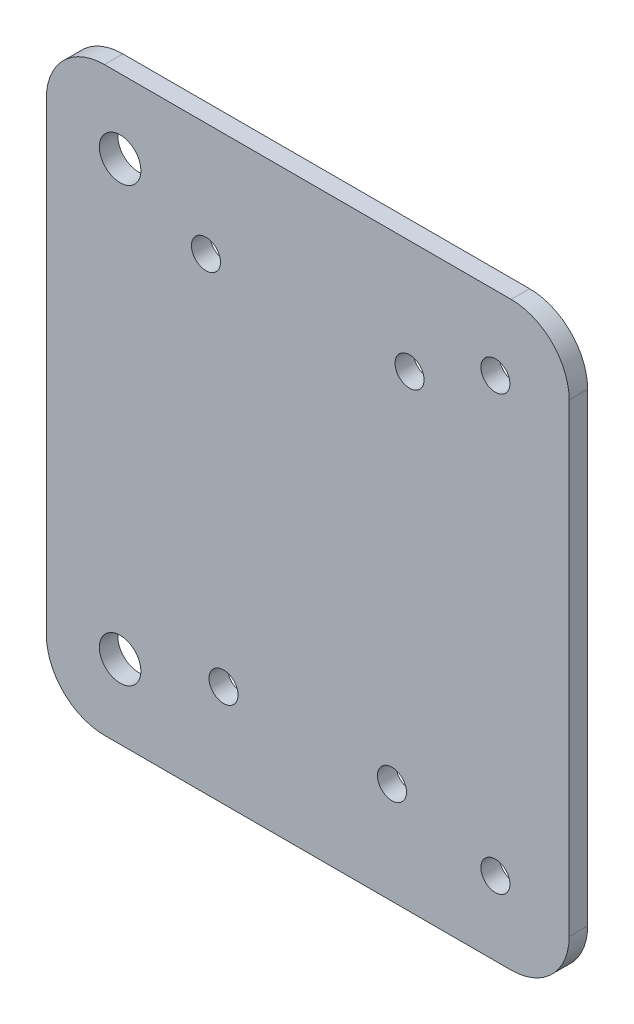
ISO-10303-21;
HEADER;
FILE_DESCRIPTION(('STEP AP214'),'2;1');
FILE_NAME('part.step','',(''),(''),'','','');
FILE_SCHEMA(('AUTOMOTIVE_DESIGN { 1 0 10303 214 1 1 1 1 }'));
ENDSEC;
DATA;
#1=APPLICATION_CONTEXT('core data for automotive mechanical design processes');
#2=APPLICATION_PROTOCOL_DEFINITION('international standard','automotive_design',2000,#1);
#3=PRODUCT_CONTEXT('',#1,'mechanical');
#4=PRODUCT('Part','Part','',(#3));
#5=PRODUCT_RELATED_PRODUCT_CATEGORY('part','',(#4));
#6=PRODUCT_DEFINITION_FORMATION('','',#4);
#7=PRODUCT_DEFINITION_CONTEXT('part definition',#1,'design');
#8=PRODUCT_DEFINITION('design','',#6,#7);
#9=PRODUCT_DEFINITION_SHAPE('','',#8);
#10=(LENGTH_UNIT() NAMED_UNIT(*) SI_UNIT(.MILLI.,.METRE.));
#11=(NAMED_UNIT(*) PLANE_ANGLE_UNIT() SI_UNIT($,.RADIAN.));
#12=(NAMED_UNIT(*) SI_UNIT($,.STERADIAN.) SOLID_ANGLE_UNIT());
#13=UNCERTAINTY_MEASURE_WITH_UNIT(LENGTH_MEASURE(1.E-05),#10,'distance_accuracy_value','');
#14=(GEOMETRIC_REPRESENTATION_CONTEXT(3) GLOBAL_UNCERTAINTY_ASSIGNED_CONTEXT((#13)) GLOBAL_UNIT_ASSIGNED_CONTEXT((#10,
#11,#12)) REPRESENTATION_CONTEXT('',''));
#15=CARTESIAN_POINT('',(0.,0.,0.));
#16=DIRECTION('',(0.,0.,1.));
#17=DIRECTION('',(1.,0.,0.));
#18=AXIS2_PLACEMENT_3D('',#15,#16,#17);
#19=CARTESIAN_POINT('',(-45.,-55.,-3.18));
#20=DIRECTION('',(-1.,0.,0.));
#21=DIRECTION('',(0.,0.,1.));
#22=AXIS2_PLACEMENT_3D('',#19,#20,#21);
#23=PLANE('',#22);
#24=DIRECTION('',(0.,-1.,0.));
#25=VECTOR('',#24,1.);
#26=CARTESIAN_POINT('',(-45.,-55.,-3.18));
#27=LINE('',#26,#25);
#28=CARTESIAN_POINT('',(-45.,35.,-3.18));
#29=VERTEX_POINT('',#28);
#30=CARTESIAN_POINT('',(-45.,-45.,-3.18));
#31=VERTEX_POINT('',#30);
#32=EDGE_CURVE('E155',#29,#31,#27,.T.);
#33=ORIENTED_EDGE('',*,*,#32,.T.);
#34=DIRECTION('',(0.,0.,1.));
#35=VECTOR('',#34,1.);
#36=CARTESIAN_POINT('',(-45.,-45.,-3.18));
#37=LINE('',#36,#35);
#38=CARTESIAN_POINT('',(-45.,-45.,0.));
#39=VERTEX_POINT('',#38);
#40=EDGE_CURVE('E11',#31,#39,#37,.T.);
#41=ORIENTED_EDGE('',*,*,#40,.T.);
#42=DIRECTION('',(0.,-1.,0.));
#43=VECTOR('',#42,1.);
#44=CARTESIAN_POINT('',(-45.,-55.,0.));
#45=LINE('',#44,#43);
#46=CARTESIAN_POINT('',(-45.,35.,0.));
#47=VERTEX_POINT('',#46);
#48=EDGE_CURVE('E105',#47,#39,#45,.T.);
#49=ORIENTED_EDGE('',*,*,#48,.F.);
#50=DIRECTION('',(0.,0.,1.));
#51=VECTOR('',#50,1.);
#52=CARTESIAN_POINT('',(-45.,35.,-3.18));
#53=LINE('',#52,#51);
#54=EDGE_CURVE('E41',#47,#29,#53,.F.);
#55=ORIENTED_EDGE('',*,*,#54,.T.);
#56=EDGE_LOOP('',(#33,#41,#49,#55));
#57=FACE_BOUND('',#56,.T.);
#58=ADVANCED_FACE('F33',(#57),#23,.T.);
#59=CARTESIAN_POINT('',(-45.,45.,-3.18));
#60=DIRECTION('',(0.,1.,0.));
#61=DIRECTION('',(0.,0.,1.));
#62=AXIS2_PLACEMENT_3D('',#59,#60,#61);
#63=PLANE('',#62);
#64=DIRECTION('',(-1.,0.,0.));
#65=VECTOR('',#64,1.);
#66=CARTESIAN_POINT('',(-45.,45.,0.));
#67=LINE('',#66,#65);
#68=CARTESIAN_POINT('',(35.,45.,0.));
#69=VERTEX_POINT('',#68);
#70=CARTESIAN_POINT('',(-35.,45.,0.));
#71=VERTEX_POINT('',#70);
#72=EDGE_CURVE('E131',#69,#71,#67,.T.);
#73=ORIENTED_EDGE('',*,*,#72,.F.);
#74=DIRECTION('',(0.,0.,1.));
#75=VECTOR('',#74,1.);
#76=CARTESIAN_POINT('',(35.,45.,-3.18));
#77=LINE('',#76,#75);
#78=CARTESIAN_POINT('',(35.,45.,-3.18));
#79=VERTEX_POINT('',#78);
#80=EDGE_CURVE('E55',#69,#79,#77,.F.);
#81=ORIENTED_EDGE('',*,*,#80,.T.);
#82=DIRECTION('',(-1.,0.,0.));
#83=VECTOR('',#82,1.);
#84=CARTESIAN_POINT('',(-45.,45.,-3.18));
#85=LINE('',#84,#83);
#86=CARTESIAN_POINT('',(-35.,45.,-3.18));
#87=VERTEX_POINT('',#86);
#88=EDGE_CURVE('E125',#79,#87,#85,.T.);
#89=ORIENTED_EDGE('',*,*,#88,.T.);
#90=DIRECTION('',(0.,0.,1.));
#91=VECTOR('',#90,1.);
#92=CARTESIAN_POINT('',(-35.,45.,-3.18));
#93=LINE('',#92,#91);
#94=EDGE_CURVE('E149',#87,#71,#93,.T.);
#95=ORIENTED_EDGE('',*,*,#94,.T.);
#96=EDGE_LOOP('',(#73,#81,#89,#95));
#97=FACE_BOUND('',#96,.T.);
#98=ADVANCED_FACE('F163',(#97),#63,.T.);
#99=CARTESIAN_POINT('',(45.,-55.,-3.18));
#100=DIRECTION('',(1.,0.,0.));
#101=DIRECTION('',(0.,0.,-1.));
#102=AXIS2_PLACEMENT_3D('',#99,#100,#101);
#103=PLANE('',#102);
#104=DIRECTION('',(0.,1.,0.));
#105=VECTOR('',#104,1.);
#106=CARTESIAN_POINT('',(45.,-55.,0.));
#107=LINE('',#106,#105);
#108=CARTESIAN_POINT('',(45.,-45.,0.));
#109=VERTEX_POINT('',#108);
#110=CARTESIAN_POINT('',(45.,35.,0.));
#111=VERTEX_POINT('',#110);
#112=EDGE_CURVE('E120',#109,#111,#107,.T.);
#113=ORIENTED_EDGE('',*,*,#112,.F.);
#114=DIRECTION('',(0.,0.,1.));
#115=VECTOR('',#114,1.);
#116=CARTESIAN_POINT('',(45.,-45.,-3.18));
#117=LINE('',#116,#115);
#118=CARTESIAN_POINT('',(45.,-45.,-3.18));
#119=VERTEX_POINT('',#118);
#120=EDGE_CURVE('E141',#109,#119,#117,.F.);
#121=ORIENTED_EDGE('',*,*,#120,.T.);
#122=DIRECTION('',(0.,1.,0.));
#123=VECTOR('',#122,1.);
#124=CARTESIAN_POINT('',(45.,-55.,-3.18));
#125=LINE('',#124,#123);
#126=CARTESIAN_POINT('',(45.,35.,-3.18));
#127=VERTEX_POINT('',#126);
#128=EDGE_CURVE('E128',#119,#127,#125,.T.);
#129=ORIENTED_EDGE('',*,*,#128,.T.);
#130=DIRECTION('',(0.,0.,1.));
#131=VECTOR('',#130,1.);
#132=CARTESIAN_POINT('',(45.,35.,-3.18));
#133=LINE('',#132,#131);
#134=EDGE_CURVE('E138',#127,#111,#133,.T.);
#135=ORIENTED_EDGE('',*,*,#134,.T.);
#136=EDGE_LOOP('',(#113,#121,#129,#135));
#137=FACE_BOUND('',#136,.T.);
#138=ADVANCED_FACE('F258',(#137),#103,.T.);
#139=CARTESIAN_POINT('',(-45.,-55.,-3.18));
#140=DIRECTION('',(0.,-1.,0.));
#141=DIRECTION('',(0.,0.,-1.));
#142=AXIS2_PLACEMENT_3D('',#139,#140,#141);
#143=PLANE('',#142);
#144=DIRECTION('',(1.,0.,0.));
#145=VECTOR('',#144,1.);
#146=CARTESIAN_POINT('',(-45.,-55.,-3.18));
#147=LINE('',#146,#145);
#148=CARTESIAN_POINT('',(-35.,-55.,-3.18));
#149=VERTEX_POINT('',#148);
#150=CARTESIAN_POINT('',(35.,-55.,-3.18));
#151=VERTEX_POINT('',#150);
#152=EDGE_CURVE('E159',#149,#151,#147,.T.);
#153=ORIENTED_EDGE('',*,*,#152,.T.);
#154=DIRECTION('',(0.,0.,1.));
#155=VECTOR('',#154,1.);
#156=CARTESIAN_POINT('',(35.,-55.,-3.18));
#157=LINE('',#156,#155);
#158=CARTESIAN_POINT('',(35.,-55.,0.));
#159=VERTEX_POINT('',#158);
#160=EDGE_CURVE('E119',#151,#159,#157,.T.);
#161=ORIENTED_EDGE('',*,*,#160,.T.);
#162=DIRECTION('',(1.,0.,0.));
#163=VECTOR('',#162,1.);
#164=CARTESIAN_POINT('',(-45.,-55.,0.));
#165=LINE('',#164,#163);
#166=CARTESIAN_POINT('',(-35.,-55.,0.));
#167=VERTEX_POINT('',#166);
#168=EDGE_CURVE('E103',#167,#159,#165,.T.);
#169=ORIENTED_EDGE('',*,*,#168,.F.);
#170=DIRECTION('',(0.,0.,1.));
#171=VECTOR('',#170,1.);
#172=CARTESIAN_POINT('',(-35.,-55.,-3.18));
#173=LINE('',#172,#171);
#174=EDGE_CURVE('E116',#167,#149,#173,.F.);
#175=ORIENTED_EDGE('',*,*,#174,.T.);
#176=EDGE_LOOP('',(#153,#161,#169,#175));
#177=FACE_BOUND('',#176,.T.);
#178=ADVANCED_FACE('F115',(#177),#143,.T.);
#179=CARTESIAN_POINT('',(0.,0.,-3.18));
#180=DIRECTION('',(0.,0.,-1.));
#181=DIRECTION('',(-1.,0.,0.));
#182=AXIS2_PLACEMENT_3D('',#179,#180,#181);
#183=PLANE('',#182);
#184=CARTESIAN_POINT('',(17.5231464345678,25.5077588546236,-3.18));
#185=DIRECTION('',(0.,0.,-1.));
#186=DIRECTION('',(-1.,0.,0.));
#187=AXIS2_PLACEMENT_3D('',#184,#185,#186);
#188=CIRCLE('',#187,2.5);
#189=CARTESIAN_POINT('',(15.0231464345678,25.5077588546236,-3.18));
#190=VERTEX_POINT('',#189);
#191=EDGE_CURVE('E213',#190,#190,#188,.T.);
#192=ORIENTED_EDGE('',*,*,#191,.F.);
#193=EDGE_LOOP('',(#192));
#194=FACE_BOUND('',#193,.T.);
#195=CARTESIAN_POINT('',(-17.5231464345675,25.5077588546236,-3.18));
#196=DIRECTION('',(0.,0.,-1.));
#197=DIRECTION('',(-1.,0.,0.));
#198=AXIS2_PLACEMENT_3D('',#195,#196,#197);
#199=CIRCLE('',#198,2.5);
#200=CARTESIAN_POINT('',(-20.0231464345675,25.5077588546236,-3.18));
#201=VERTEX_POINT('',#200);
#202=EDGE_CURVE('E207',#201,#201,#199,.T.);
#203=ORIENTED_EDGE('',*,*,#202,.F.);
#204=EDGE_LOOP('',(#203));
#205=FACE_BOUND('',#204,.T.);
#206=CARTESIAN_POINT('',(14.5000000000002,-37.5,-3.18));
#207=DIRECTION('',(0.,0.,-1.));
#208=DIRECTION('',(-1.,0.,0.));
#209=AXIS2_PLACEMENT_3D('',#206,#207,#208);
#210=CIRCLE('',#209,2.5);
#211=CARTESIAN_POINT('',(12.0000000000002,-37.5,-3.18));
#212=VERTEX_POINT('',#211);
#213=EDGE_CURVE('E201',#212,#212,#210,.T.);
#214=ORIENTED_EDGE('',*,*,#213,.F.);
#215=EDGE_LOOP('',(#214));
#216=FACE_BOUND('',#215,.T.);
#217=CARTESIAN_POINT('',(-14.4999999999998,-37.5,-3.18));
#218=DIRECTION('',(0.,0.,-1.));
#219=DIRECTION('',(-1.,0.,0.));
#220=AXIS2_PLACEMENT_3D('',#217,#218,#219);
#221=CIRCLE('',#220,2.5);
#222=CARTESIAN_POINT('',(-16.9999999999998,-37.5,-3.18));
#223=VERTEX_POINT('',#222);
#224=EDGE_CURVE('E193',#223,#223,#221,.T.);
#225=ORIENTED_EDGE('',*,*,#224,.F.);
#226=EDGE_LOOP('',(#225));
#227=FACE_BOUND('',#226,.T.);
#228=CARTESIAN_POINT('',(32.3,32.3000000000001,-3.18));
#229=DIRECTION('',(0.,0.,1.));
#230=DIRECTION('',(1.,0.,0.));
#231=AXIS2_PLACEMENT_3D('',#228,#229,#230);
#232=CIRCLE('',#231,2.5);
#233=CARTESIAN_POINT('',(34.8,32.3000000000001,-3.18));
#234=VERTEX_POINT('',#233);
#235=EDGE_CURVE('E187',#234,#234,#232,.T.);
#236=ORIENTED_EDGE('',*,*,#235,.T.);
#237=EDGE_LOOP('',(#236));
#238=FACE_BOUND('',#237,.T.);
#239=CARTESIAN_POINT('',(-32.3,32.3,-3.18));
#240=DIRECTION('',(0.,0.,1.));
#241=DIRECTION('',(1.,0.,0.));
#242=AXIS2_PLACEMENT_3D('',#239,#240,#241);
#243=CIRCLE('',#242,3.57);
#244=CARTESIAN_POINT('',(-28.73,32.3,-3.18));
#245=VERTEX_POINT('',#244);
#246=EDGE_CURVE('E181',#245,#245,#243,.T.);
#247=ORIENTED_EDGE('',*,*,#246,.T.);
#248=EDGE_LOOP('',(#247));
#249=FACE_BOUND('',#248,.T.);
#250=CARTESIAN_POINT('',(-32.3,-42.3,-3.18));
#251=DIRECTION('',(0.,0.,1.));
#252=DIRECTION('',(1.,0.,0.));
#253=AXIS2_PLACEMENT_3D('',#250,#251,#252);
#254=CIRCLE('',#253,3.57);
#255=CARTESIAN_POINT('',(-28.73,-42.3,-3.18));
#256=VERTEX_POINT('',#255);
#257=EDGE_CURVE('E175',#256,#256,#254,.T.);
#258=ORIENTED_EDGE('',*,*,#257,.T.);
#259=EDGE_LOOP('',(#258));
#260=FACE_BOUND('',#259,.T.);
#261=CARTESIAN_POINT('',(32.3,-42.3,-3.18));
#262=DIRECTION('',(0.,0.,1.));
#263=DIRECTION('',(1.,0.,0.));
#264=AXIS2_PLACEMENT_3D('',#261,#262,#263);
#265=CIRCLE('',#264,2.5);
#266=CARTESIAN_POINT('',(34.8,-42.3,-3.18));
#267=VERTEX_POINT('',#266);
#268=EDGE_CURVE('E167',#267,#267,#265,.T.);
#269=ORIENTED_EDGE('',*,*,#268,.T.);
#270=EDGE_LOOP('',(#269));
#271=FACE_BOUND('',#270,.T.);
#272=ORIENTED_EDGE('',*,*,#128,.F.);
#273=CARTESIAN_POINT('',(35.,-45.,-3.18));
#274=DIRECTION('',(0.,0.,-1.));
#275=DIRECTION('',(-1.,0.,0.));
#276=AXIS2_PLACEMENT_3D('',#273,#274,#275);
#277=CIRCLE('',#276,10.);
#278=EDGE_CURVE('E147',#119,#151,#277,.T.);
#279=ORIENTED_EDGE('',*,*,#278,.T.);
#280=ORIENTED_EDGE('',*,*,#152,.F.);
#281=CARTESIAN_POINT('',(-35.,-45.,-3.18));
#282=DIRECTION('',(0.,0.,-1.));
#283=DIRECTION('',(-1.,0.,0.));
#284=AXIS2_PLACEMENT_3D('',#281,#282,#283);
#285=CIRCLE('',#284,10.);
#286=EDGE_CURVE('E124',#149,#31,#285,.T.);
#287=ORIENTED_EDGE('',*,*,#286,.T.);
#288=ORIENTED_EDGE('',*,*,#32,.F.);
#289=CARTESIAN_POINT('',(-35.,35.,-3.18));
#290=DIRECTION('',(0.,0.,-1.));
#291=DIRECTION('',(-1.,0.,0.));
#292=AXIS2_PLACEMENT_3D('',#289,#290,#291);
#293=CIRCLE('',#292,10.);
#294=EDGE_CURVE('E48',#29,#87,#293,.T.);
#295=ORIENTED_EDGE('',*,*,#294,.T.);
#296=ORIENTED_EDGE('',*,*,#88,.F.);
#297=CARTESIAN_POINT('',(35.,35.,-3.18));
#298=DIRECTION('',(0.,0.,-1.));
#299=DIRECTION('',(-1.,0.,0.));
#300=AXIS2_PLACEMENT_3D('',#297,#298,#299);
#301=CIRCLE('',#300,10.);
#302=EDGE_CURVE('E145',#79,#127,#301,.T.);
#303=ORIENTED_EDGE('',*,*,#302,.T.);
#304=EDGE_LOOP('',(#272,#279,#280,#287,#288,#295,#296,#303));
#305=FACE_BOUND('',#304,.T.);
#306=ADVANCED_FACE('F158',(#194,#205,#216,#227,#238,#249,#260,#271,#305),#183,.T.);
#307=CARTESIAN_POINT('',(0.,0.,0.));
#308=DIRECTION('',(0.,0.,-1.));
#309=DIRECTION('',(-1.,0.,0.));
#310=AXIS2_PLACEMENT_3D('',#307,#308,#309);
#311=PLANE('',#310);
#312=CARTESIAN_POINT('',(17.5231464345678,25.5077588546236,0.));
#313=DIRECTION('',(0.,0.,1.));
#314=DIRECTION('',(1.,0.,0.));
#315=AXIS2_PLACEMENT_3D('',#312,#313,#314);
#316=CIRCLE('',#315,2.5);
#317=CARTESIAN_POINT('',(20.0231464345678,25.5077588546236,0.));
#318=VERTEX_POINT('',#317);
#319=EDGE_CURVE('E216',#318,#318,#316,.T.);
#320=ORIENTED_EDGE('',*,*,#319,.F.);
#321=EDGE_LOOP('',(#320));
#322=FACE_BOUND('',#321,.T.);
#323=CARTESIAN_POINT('',(-17.5231464345675,25.5077588546236,0.));
#324=DIRECTION('',(0.,0.,1.));
#325=DIRECTION('',(1.,0.,0.));
#326=AXIS2_PLACEMENT_3D('',#323,#324,#325);
#327=CIRCLE('',#326,2.5);
#328=CARTESIAN_POINT('',(-15.0231464345675,25.5077588546236,0.));
#329=VERTEX_POINT('',#328);
#330=EDGE_CURVE('E210',#329,#329,#327,.T.);
#331=ORIENTED_EDGE('',*,*,#330,.F.);
#332=EDGE_LOOP('',(#331));
#333=FACE_BOUND('',#332,.T.);
#334=CARTESIAN_POINT('',(14.5000000000002,-37.5,0.));
#335=DIRECTION('',(0.,0.,1.));
#336=DIRECTION('',(1.,0.,0.));
#337=AXIS2_PLACEMENT_3D('',#334,#335,#336);
#338=CIRCLE('',#337,2.5);
#339=CARTESIAN_POINT('',(17.0000000000002,-37.5,0.));
#340=VERTEX_POINT('',#339);
#341=EDGE_CURVE('E204',#340,#340,#338,.T.);
#342=ORIENTED_EDGE('',*,*,#341,.F.);
#343=EDGE_LOOP('',(#342));
#344=FACE_BOUND('',#343,.T.);
#345=CARTESIAN_POINT('',(-14.4999999999998,-37.5,0.));
#346=DIRECTION('',(0.,0.,1.));
#347=DIRECTION('',(1.,0.,0.));
#348=AXIS2_PLACEMENT_3D('',#345,#346,#347);
#349=CIRCLE('',#348,2.5);
#350=CARTESIAN_POINT('',(-11.9999999999998,-37.5,0.));
#351=VERTEX_POINT('',#350);
#352=EDGE_CURVE('E198',#351,#351,#349,.T.);
#353=ORIENTED_EDGE('',*,*,#352,.F.);
#354=EDGE_LOOP('',(#353));
#355=FACE_BOUND('',#354,.T.);
#356=CARTESIAN_POINT('',(32.3,32.3000000000001,0.));
#357=DIRECTION('',(0.,0.,1.));
#358=DIRECTION('',(1.,0.,0.));
#359=AXIS2_PLACEMENT_3D('',#356,#357,#358);
#360=CIRCLE('',#359,2.5);
#361=CARTESIAN_POINT('',(34.8,32.3000000000001,0.));
#362=VERTEX_POINT('',#361);
#363=EDGE_CURVE('E190',#362,#362,#360,.T.);
#364=ORIENTED_EDGE('',*,*,#363,.F.);
#365=EDGE_LOOP('',(#364));
#366=FACE_BOUND('',#365,.T.);
#367=CARTESIAN_POINT('',(-32.3,32.3,0.));
#368=DIRECTION('',(0.,0.,1.));
#369=DIRECTION('',(1.,0.,0.));
#370=AXIS2_PLACEMENT_3D('',#367,#368,#369);
#371=CIRCLE('',#370,3.57);
#372=CARTESIAN_POINT('',(-28.73,32.3,0.));
#373=VERTEX_POINT('',#372);
#374=EDGE_CURVE('E184',#373,#373,#371,.T.);
#375=ORIENTED_EDGE('',*,*,#374,.F.);
#376=EDGE_LOOP('',(#375));
#377=FACE_BOUND('',#376,.T.);
#378=CARTESIAN_POINT('',(-32.3,-42.3,0.));
#379=DIRECTION('',(0.,0.,1.));
#380=DIRECTION('',(1.,0.,0.));
#381=AXIS2_PLACEMENT_3D('',#378,#379,#380);
#382=CIRCLE('',#381,3.57);
#383=CARTESIAN_POINT('',(-28.73,-42.3,0.));
#384=VERTEX_POINT('',#383);
#385=EDGE_CURVE('E178',#384,#384,#382,.T.);
#386=ORIENTED_EDGE('',*,*,#385,.F.);
#387=EDGE_LOOP('',(#386));
#388=FACE_BOUND('',#387,.T.);
#389=CARTESIAN_POINT('',(32.3,-42.3,0.));
#390=DIRECTION('',(0.,0.,1.));
#391=DIRECTION('',(1.,0.,0.));
#392=AXIS2_PLACEMENT_3D('',#389,#390,#391);
#393=CIRCLE('',#392,2.5);
#394=CARTESIAN_POINT('',(34.8,-42.3,0.));
#395=VERTEX_POINT('',#394);
#396=EDGE_CURVE('E172',#395,#395,#393,.T.);
#397=ORIENTED_EDGE('',*,*,#396,.F.);
#398=EDGE_LOOP('',(#397));
#399=FACE_BOUND('',#398,.T.);
#400=ORIENTED_EDGE('',*,*,#168,.T.);
#401=CARTESIAN_POINT('',(35.,-45.,0.));
#402=DIRECTION('',(0.,0.,-1.));
#403=DIRECTION('',(-1.,0.,0.));
#404=AXIS2_PLACEMENT_3D('',#401,#402,#403);
#405=CIRCLE('',#404,10.);
#406=EDGE_CURVE('E136',#159,#109,#405,.F.);
#407=ORIENTED_EDGE('',*,*,#406,.T.);
#408=ORIENTED_EDGE('',*,*,#112,.T.);
#409=CARTESIAN_POINT('',(35.,35.,0.));
#410=DIRECTION('',(0.,0.,-1.));
#411=DIRECTION('',(-1.,0.,0.));
#412=AXIS2_PLACEMENT_3D('',#409,#410,#411);
#413=CIRCLE('',#412,10.);
#414=EDGE_CURVE('E109',#111,#69,#413,.F.);
#415=ORIENTED_EDGE('',*,*,#414,.T.);
#416=ORIENTED_EDGE('',*,*,#72,.T.);
#417=CARTESIAN_POINT('',(-35.,35.,0.));
#418=DIRECTION('',(0.,0.,-1.));
#419=DIRECTION('',(-1.,0.,0.));
#420=AXIS2_PLACEMENT_3D('',#417,#418,#419);
#421=CIRCLE('',#420,10.);
#422=EDGE_CURVE('E110',#71,#47,#421,.F.);
#423=ORIENTED_EDGE('',*,*,#422,.T.);
#424=ORIENTED_EDGE('',*,*,#48,.T.);
#425=CARTESIAN_POINT('',(-35.,-45.,0.));
#426=DIRECTION('',(0.,0.,-1.));
#427=DIRECTION('',(-1.,0.,0.));
#428=AXIS2_PLACEMENT_3D('',#425,#426,#427);
#429=CIRCLE('',#428,10.);
#430=EDGE_CURVE('E100',#39,#167,#429,.F.);
#431=ORIENTED_EDGE('',*,*,#430,.T.);
#432=EDGE_LOOP('',(#400,#407,#408,#415,#416,#423,#424,#431));
#433=FACE_BOUND('',#432,.T.);
#434=ADVANCED_FACE('F102',(#322,#333,#344,#355,#366,#377,#388,#399,#433),#311,.F.);
#435=CARTESIAN_POINT('',(32.3,-42.3,-3.18));
#436=DIRECTION('',(0.,0.,1.));
#437=DIRECTION('',(1.,0.,0.));
#438=AXIS2_PLACEMENT_3D('',#435,#436,#437);
#439=CYLINDRICAL_SURFACE('',#438,2.5);
#440=CARTESIAN_POINT('',(34.8,-42.3,-3.18));
#441=CARTESIAN_POINT('',(34.8,-42.3,-3.146875));
#442=CARTESIAN_POINT('',(34.8,-42.3,-3.11375));
#443=CARTESIAN_POINT('',(34.8,-42.3,-3.0475));
#444=CARTESIAN_POINT('',(34.8,-42.3,-3.014375));
#445=CARTESIAN_POINT('',(34.8,-42.3,-2.948125));
#446=CARTESIAN_POINT('',(34.8,-42.3,-2.915));
#447=CARTESIAN_POINT('',(34.8,-42.3,-2.84875));
#448=CARTESIAN_POINT('',(34.8,-42.3,-2.815625));
#449=CARTESIAN_POINT('',(34.8,-42.3,-2.749375));
#450=CARTESIAN_POINT('',(34.8,-42.3,-2.71625));
#451=CARTESIAN_POINT('',(34.8,-42.3,-2.65));
#452=CARTESIAN_POINT('',(34.8,-42.3,-2.616875));
#453=CARTESIAN_POINT('',(34.8,-42.3,-2.550625));
#454=CARTESIAN_POINT('',(34.8,-42.3,-2.5175));
#455=CARTESIAN_POINT('',(34.8,-42.3,-2.45125));
#456=CARTESIAN_POINT('',(34.8,-42.3,-2.418125));
#457=CARTESIAN_POINT('',(34.8,-42.3,-2.351875));
#458=CARTESIAN_POINT('',(34.8,-42.3,-2.31875));
#459=CARTESIAN_POINT('',(34.8,-42.3,-2.2525));
#460=CARTESIAN_POINT('',(34.8,-42.3,-2.219375));
#461=CARTESIAN_POINT('',(34.8,-42.3,-2.153125));
#462=CARTESIAN_POINT('',(34.8,-42.3,-2.12));
#463=CARTESIAN_POINT('',(34.8,-42.3,-2.05375));
#464=CARTESIAN_POINT('',(34.8,-42.3,-2.020625));
#465=CARTESIAN_POINT('',(34.8,-42.3,-1.954375));
#466=CARTESIAN_POINT('',(34.8,-42.3,-1.92125));
#467=CARTESIAN_POINT('',(34.8,-42.3,-1.855));
#468=CARTESIAN_POINT('',(34.8,-42.3,-1.821875));
#469=CARTESIAN_POINT('',(34.8,-42.3,-1.755625));
#470=CARTESIAN_POINT('',(34.8,-42.3,-1.7225));
#471=CARTESIAN_POINT('',(34.8,-42.3,-1.65625));
#472=CARTESIAN_POINT('',(34.8,-42.3,-1.623125));
#473=CARTESIAN_POINT('',(34.8,-42.3,-1.556875));
#474=CARTESIAN_POINT('',(34.8,-42.3,-1.52375));
#475=CARTESIAN_POINT('',(34.8,-42.3,-1.4575));
#476=CARTESIAN_POINT('',(34.8,-42.3,-1.424375));
#477=CARTESIAN_POINT('',(34.8,-42.3,-1.358125));
#478=CARTESIAN_POINT('',(34.8,-42.3,-1.325));
#479=CARTESIAN_POINT('',(34.8,-42.3,-1.25875));
#480=CARTESIAN_POINT('',(34.8,-42.3,-1.225625));
#481=CARTESIAN_POINT('',(34.8,-42.3,-1.159375));
#482=CARTESIAN_POINT('',(34.8,-42.3,-1.12625));
#483=CARTESIAN_POINT('',(34.8,-42.3,-1.06));
#484=CARTESIAN_POINT('',(34.8,-42.3,-1.026875));
#485=CARTESIAN_POINT('',(34.8,-42.3,-0.960625));
#486=CARTESIAN_POINT('',(34.8,-42.3,-0.9275));
#487=CARTESIAN_POINT('',(34.8,-42.3,-0.86125));
#488=CARTESIAN_POINT('',(34.8,-42.3,-0.828125));
#489=CARTESIAN_POINT('',(34.8,-42.3,-0.761875));
#490=CARTESIAN_POINT('',(34.8,-42.3,-0.72875));
#491=CARTESIAN_POINT('',(34.8,-42.3,-0.6625));
#492=CARTESIAN_POINT('',(34.8,-42.3,-0.629375));
#493=CARTESIAN_POINT('',(34.8,-42.3,-0.563125));
#494=CARTESIAN_POINT('',(34.8,-42.3,-0.53));
#495=CARTESIAN_POINT('',(34.8,-42.3,-0.46375));
#496=CARTESIAN_POINT('',(34.8,-42.3,-0.430625));
#497=CARTESIAN_POINT('',(34.8,-42.3,-0.364375));
#498=CARTESIAN_POINT('',(34.8,-42.3,-0.33125));
#499=CARTESIAN_POINT('',(34.8,-42.3,-0.265));
#500=CARTESIAN_POINT('',(34.8,-42.3,-0.231875));
#501=CARTESIAN_POINT('',(34.8,-42.3,-0.165625));
#502=CARTESIAN_POINT('',(34.8,-42.3,-0.1325));
#503=CARTESIAN_POINT('',(34.8,-42.3,-0.06625));
#504=CARTESIAN_POINT('',(34.8,-42.3,-0.033125));
#505=CARTESIAN_POINT('',(34.8,-42.3,0.));
#506=B_SPLINE_CURVE_WITH_KNOTS('',3,(#440,#441,#442,#443,#444,#445,#446,#447,#448,#449,#450,
#451,#452,#453,#454,#455,#456,#457,#458,#459,#460,#461,#462,#463,#464,#465,#466,#467,#468,#469,
#470,#471,#472,#473,#474,#475,#476,#477,#478,#479,#480,#481,#482,#483,#484,#485,#486,#487,#488,
#489,#490,#491,#492,#493,#494,#495,#496,#497,#498,#499,#500,#501,#502,#503,#504,#505),
.UNSPECIFIED.,.F.,.F.,(4,2,2,2,2,2,2,2,2,2,2,2,2,2,2,2,2,2,2,2,2,2,2,2,2,2,2,2,2,2,2,2,4),(0.,
0.0993749999999996,0.19875,0.298125,0.3975,0.496875,0.59625,0.695625,0.795,0.894375,0.99375,
1.093125,1.1925,1.291875,1.39125,1.490625,1.59,1.689375,1.78875,1.888125,1.9875,2.086875,
2.18625,2.285625,2.385,2.484375,2.58375,2.683125,2.7825,2.881875,2.98125,3.080625,3.18),.UNSPECIFIED.);
#507=EDGE_CURVE('BSEAM224',#267,#395,#506,.T.);
#508=ORIENTED_EDGE('',*,*,#268,.F.);
#509=ORIENTED_EDGE('',*,*,#396,.T.);
#510=ORIENTED_EDGE('',*,*,#507,.T.);
#511=ORIENTED_EDGE('',*,*,#507,.F.);
#512=EDGE_LOOP('',(#508,#510,#509,#511));
#513=FACE_BOUND('',#512,.T.);
#514=ADVANCED_FACE('F224',(#513),#439,.F.);
#515=CARTESIAN_POINT('',(-32.3,-42.3,-3.18));
#516=DIRECTION('',(0.,0.,1.));
#517=DIRECTION('',(1.,0.,0.));
#518=AXIS2_PLACEMENT_3D('',#515,#516,#517);
#519=CYLINDRICAL_SURFACE('',#518,3.57);
#520=CARTESIAN_POINT('',(-28.73,-42.3,-3.18));
#521=CARTESIAN_POINT('',(-28.73,-42.3,-3.146875));
#522=CARTESIAN_POINT('',(-28.73,-42.3,-3.11375));
#523=CARTESIAN_POINT('',(-28.73,-42.3,-3.0475));
#524=CARTESIAN_POINT('',(-28.73,-42.3,-3.014375));
#525=CARTESIAN_POINT('',(-28.73,-42.3,-2.948125));
#526=CARTESIAN_POINT('',(-28.73,-42.3,-2.915));
#527=CARTESIAN_POINT('',(-28.73,-42.3,-2.84875));
#528=CARTESIAN_POINT('',(-28.73,-42.3,-2.815625));
#529=CARTESIAN_POINT('',(-28.73,-42.3,-2.749375));
#530=CARTESIAN_POINT('',(-28.73,-42.3,-2.71625));
#531=CARTESIAN_POINT('',(-28.73,-42.3,-2.65));
#532=CARTESIAN_POINT('',(-28.73,-42.3,-2.616875));
#533=CARTESIAN_POINT('',(-28.73,-42.3,-2.550625));
#534=CARTESIAN_POINT('',(-28.73,-42.3,-2.5175));
#535=CARTESIAN_POINT('',(-28.73,-42.3,-2.45125));
#536=CARTESIAN_POINT('',(-28.73,-42.3,-2.418125));
#537=CARTESIAN_POINT('',(-28.73,-42.3,-2.351875));
#538=CARTESIAN_POINT('',(-28.73,-42.3,-2.31875));
#539=CARTESIAN_POINT('',(-28.73,-42.3,-2.2525));
#540=CARTESIAN_POINT('',(-28.73,-42.3,-2.219375));
#541=CARTESIAN_POINT('',(-28.73,-42.3,-2.153125));
#542=CARTESIAN_POINT('',(-28.73,-42.3,-2.12));
#543=CARTESIAN_POINT('',(-28.73,-42.3,-2.05375));
#544=CARTESIAN_POINT('',(-28.73,-42.3,-2.020625));
#545=CARTESIAN_POINT('',(-28.73,-42.3,-1.954375));
#546=CARTESIAN_POINT('',(-28.73,-42.3,-1.92125));
#547=CARTESIAN_POINT('',(-28.73,-42.3,-1.855));
#548=CARTESIAN_POINT('',(-28.73,-42.3,-1.821875));
#549=CARTESIAN_POINT('',(-28.73,-42.3,-1.755625));
#550=CARTESIAN_POINT('',(-28.73,-42.3,-1.7225));
#551=CARTESIAN_POINT('',(-28.73,-42.3,-1.65625));
#552=CARTESIAN_POINT('',(-28.73,-42.3,-1.623125));
#553=CARTESIAN_POINT('',(-28.73,-42.3,-1.556875));
#554=CARTESIAN_POINT('',(-28.73,-42.3,-1.52375));
#555=CARTESIAN_POINT('',(-28.73,-42.3,-1.4575));
#556=CARTESIAN_POINT('',(-28.73,-42.3,-1.424375));
#557=CARTESIAN_POINT('',(-28.73,-42.3,-1.358125));
#558=CARTESIAN_POINT('',(-28.73,-42.3,-1.325));
#559=CARTESIAN_POINT('',(-28.73,-42.3,-1.25875));
#560=CARTESIAN_POINT('',(-28.73,-42.3,-1.225625));
#561=CARTESIAN_POINT('',(-28.73,-42.3,-1.159375));
#562=CARTESIAN_POINT('',(-28.73,-42.3,-1.12625));
#563=CARTESIAN_POINT('',(-28.73,-42.3,-1.06));
#564=CARTESIAN_POINT('',(-28.73,-42.3,-1.026875));
#565=CARTESIAN_POINT('',(-28.73,-42.3,-0.960625));
#566=CARTESIAN_POINT('',(-28.73,-42.3,-0.9275));
#567=CARTESIAN_POINT('',(-28.73,-42.3,-0.86125));
#568=CARTESIAN_POINT('',(-28.73,-42.3,-0.828125));
#569=CARTESIAN_POINT('',(-28.73,-42.3,-0.761875));
#570=CARTESIAN_POINT('',(-28.73,-42.3,-0.72875));
#571=CARTESIAN_POINT('',(-28.73,-42.3,-0.6625));
#572=CARTESIAN_POINT('',(-28.73,-42.3,-0.629375));
#573=CARTESIAN_POINT('',(-28.73,-42.3,-0.563125));
#574=CARTESIAN_POINT('',(-28.73,-42.3,-0.53));
#575=CARTESIAN_POINT('',(-28.73,-42.3,-0.46375));
#576=CARTESIAN_POINT('',(-28.73,-42.3,-0.430625));
#577=CARTESIAN_POINT('',(-28.73,-42.3,-0.364375));
#578=CARTESIAN_POINT('',(-28.73,-42.3,-0.33125));
#579=CARTESIAN_POINT('',(-28.73,-42.3,-0.265));
#580=CARTESIAN_POINT('',(-28.73,-42.3,-0.231875));
#581=CARTESIAN_POINT('',(-28.73,-42.3,-0.165625));
#582=CARTESIAN_POINT('',(-28.73,-42.3,-0.1325));
#583=CARTESIAN_POINT('',(-28.73,-42.3,-0.06625));
#584=CARTESIAN_POINT('',(-28.73,-42.3,-0.033125));
#585=CARTESIAN_POINT('',(-28.73,-42.3,0.));
#586=B_SPLINE_CURVE_WITH_KNOTS('',3,(#520,#521,#522,#523,#524,#525,#526,#527,#528,#529,#530,
#531,#532,#533,#534,#535,#536,#537,#538,#539,#540,#541,#542,#543,#544,#545,#546,#547,#548,#549,
#550,#551,#552,#553,#554,#555,#556,#557,#558,#559,#560,#561,#562,#563,#564,#565,#566,#567,#568,
#569,#570,#571,#572,#573,#574,#575,#576,#577,#578,#579,#580,#581,#582,#583,#584,#585),
.UNSPECIFIED.,.F.,.F.,(4,2,2,2,2,2,2,2,2,2,2,2,2,2,2,2,2,2,2,2,2,2,2,2,2,2,2,2,2,2,2,2,4),(0.,
0.0993749999999996,0.19875,0.298125,0.3975,0.496875,0.59625,0.695625,0.795,0.894375,0.99375,
1.093125,1.1925,1.291875,1.39125,1.490625,1.59,1.689375,1.78875,1.888125,1.9875,2.086875,
2.18625,2.285625,2.385,2.484375,2.58375,2.683125,2.7825,2.881875,2.98125,3.080625,3.18),.UNSPECIFIED.);
#587=EDGE_CURVE('BSEAM241',#256,#384,#586,.T.);
#588=ORIENTED_EDGE('',*,*,#257,.F.);
#589=ORIENTED_EDGE('',*,*,#385,.T.);
#590=ORIENTED_EDGE('',*,*,#587,.T.);
#591=ORIENTED_EDGE('',*,*,#587,.F.);
#592=EDGE_LOOP('',(#588,#590,#589,#591));
#593=FACE_BOUND('',#592,.T.);
#594=ADVANCED_FACE('F241',(#593),#519,.F.);
#595=CARTESIAN_POINT('',(-32.3,32.3,-3.18));
#596=DIRECTION('',(0.,0.,1.));
#597=DIRECTION('',(1.,0.,0.));
#598=AXIS2_PLACEMENT_3D('',#595,#596,#597);
#599=CYLINDRICAL_SURFACE('',#598,3.57);
#600=CARTESIAN_POINT('',(-28.73,32.3,-3.18));
#601=CARTESIAN_POINT('',(-28.73,32.3,-3.146875));
#602=CARTESIAN_POINT('',(-28.73,32.3,-3.11375));
#603=CARTESIAN_POINT('',(-28.73,32.3,-3.0475));
#604=CARTESIAN_POINT('',(-28.73,32.3,-3.014375));
#605=CARTESIAN_POINT('',(-28.73,32.3,-2.948125));
#606=CARTESIAN_POINT('',(-28.73,32.3,-2.915));
#607=CARTESIAN_POINT('',(-28.73,32.3,-2.84875));
#608=CARTESIAN_POINT('',(-28.73,32.3,-2.815625));
#609=CARTESIAN_POINT('',(-28.73,32.3,-2.749375));
#610=CARTESIAN_POINT('',(-28.73,32.3,-2.71625));
#611=CARTESIAN_POINT('',(-28.73,32.3,-2.65));
#612=CARTESIAN_POINT('',(-28.73,32.3,-2.616875));
#613=CARTESIAN_POINT('',(-28.73,32.3,-2.550625));
#614=CARTESIAN_POINT('',(-28.73,32.3,-2.5175));
#615=CARTESIAN_POINT('',(-28.73,32.3,-2.45125));
#616=CARTESIAN_POINT('',(-28.73,32.3,-2.418125));
#617=CARTESIAN_POINT('',(-28.73,32.3,-2.351875));
#618=CARTESIAN_POINT('',(-28.73,32.3,-2.31875));
#619=CARTESIAN_POINT('',(-28.73,32.3,-2.2525));
#620=CARTESIAN_POINT('',(-28.73,32.3,-2.219375));
#621=CARTESIAN_POINT('',(-28.73,32.3,-2.153125));
#622=CARTESIAN_POINT('',(-28.73,32.3,-2.12));
#623=CARTESIAN_POINT('',(-28.73,32.3,-2.05375));
#624=CARTESIAN_POINT('',(-28.73,32.3,-2.020625));
#625=CARTESIAN_POINT('',(-28.73,32.3,-1.954375));
#626=CARTESIAN_POINT('',(-28.73,32.3,-1.92125));
#627=CARTESIAN_POINT('',(-28.73,32.3,-1.855));
#628=CARTESIAN_POINT('',(-28.73,32.3,-1.821875));
#629=CARTESIAN_POINT('',(-28.73,32.3,-1.755625));
#630=CARTESIAN_POINT('',(-28.73,32.3,-1.7225));
#631=CARTESIAN_POINT('',(-28.73,32.3,-1.65625));
#632=CARTESIAN_POINT('',(-28.73,32.3,-1.623125));
#633=CARTESIAN_POINT('',(-28.73,32.3,-1.556875));
#634=CARTESIAN_POINT('',(-28.73,32.3,-1.52375));
#635=CARTESIAN_POINT('',(-28.73,32.3,-1.4575));
#636=CARTESIAN_POINT('',(-28.73,32.3,-1.424375));
#637=CARTESIAN_POINT('',(-28.73,32.3,-1.358125));
#638=CARTESIAN_POINT('',(-28.73,32.3,-1.325));
#639=CARTESIAN_POINT('',(-28.73,32.3,-1.25875));
#640=CARTESIAN_POINT('',(-28.73,32.3,-1.225625));
#641=CARTESIAN_POINT('',(-28.73,32.3,-1.159375));
#642=CARTESIAN_POINT('',(-28.73,32.3,-1.12625));
#643=CARTESIAN_POINT('',(-28.73,32.3,-1.06));
#644=CARTESIAN_POINT('',(-28.73,32.3,-1.026875));
#645=CARTESIAN_POINT('',(-28.73,32.3,-0.960625));
#646=CARTESIAN_POINT('',(-28.73,32.3,-0.9275));
#647=CARTESIAN_POINT('',(-28.73,32.3,-0.86125));
#648=CARTESIAN_POINT('',(-28.73,32.3,-0.828125));
#649=CARTESIAN_POINT('',(-28.73,32.3,-0.761875));
#650=CARTESIAN_POINT('',(-28.73,32.3,-0.72875));
#651=CARTESIAN_POINT('',(-28.73,32.3,-0.6625));
#652=CARTESIAN_POINT('',(-28.73,32.3,-0.629375));
#653=CARTESIAN_POINT('',(-28.73,32.3,-0.563125));
#654=CARTESIAN_POINT('',(-28.73,32.3,-0.53));
#655=CARTESIAN_POINT('',(-28.73,32.3,-0.46375));
#656=CARTESIAN_POINT('',(-28.73,32.3,-0.430625));
#657=CARTESIAN_POINT('',(-28.73,32.3,-0.364375));
#658=CARTESIAN_POINT('',(-28.73,32.3,-0.33125));
#659=CARTESIAN_POINT('',(-28.73,32.3,-0.265));
#660=CARTESIAN_POINT('',(-28.73,32.3,-0.231875));
#661=CARTESIAN_POINT('',(-28.73,32.3,-0.165625));
#662=CARTESIAN_POINT('',(-28.73,32.3,-0.1325));
#663=CARTESIAN_POINT('',(-28.73,32.3,-0.06625));
#664=CARTESIAN_POINT('',(-28.73,32.3,-0.033125));
#665=CARTESIAN_POINT('',(-28.73,32.3,0.));
#666=B_SPLINE_CURVE_WITH_KNOTS('',3,(#600,#601,#602,#603,#604,#605,#606,#607,#608,#609,#610,
#611,#612,#613,#614,#615,#616,#617,#618,#619,#620,#621,#622,#623,#624,#625,#626,#627,#628,#629,
#630,#631,#632,#633,#634,#635,#636,#637,#638,#639,#640,#641,#642,#643,#644,#645,#646,#647,#648,
#649,#650,#651,#652,#653,#654,#655,#656,#657,#658,#659,#660,#661,#662,#663,#664,#665),
.UNSPECIFIED.,.F.,.F.,(4,2,2,2,2,2,2,2,2,2,2,2,2,2,2,2,2,2,2,2,2,2,2,2,2,2,2,2,2,2,2,2,4),(0.,
0.0993749999999996,0.19875,0.298125,0.3975,0.496875,0.59625,0.695625,0.795,0.894375,0.99375,
1.093125,1.1925,1.291875,1.39125,1.490625,1.59,1.689375,1.78875,1.888125,1.9875,2.086875,
2.18625,2.285625,2.385,2.484375,2.58375,2.683125,2.7825,2.881875,2.98125,3.080625,3.18),.UNSPECIFIED.);
#667=EDGE_CURVE('BSEAM248',#245,#373,#666,.T.);
#668=ORIENTED_EDGE('',*,*,#246,.F.);
#669=ORIENTED_EDGE('',*,*,#374,.T.);
#670=ORIENTED_EDGE('',*,*,#667,.T.);
#671=ORIENTED_EDGE('',*,*,#667,.F.);
#672=EDGE_LOOP('',(#668,#670,#669,#671));
#673=FACE_BOUND('',#672,.T.);
#674=ADVANCED_FACE('F248',(#673),#599,.F.);
#675=CARTESIAN_POINT('',(32.3,32.3000000000001,-3.18));
#676=DIRECTION('',(0.,0.,1.));
#677=DIRECTION('',(1.,0.,0.));
#678=AXIS2_PLACEMENT_3D('',#675,#676,#677);
#679=CYLINDRICAL_SURFACE('',#678,2.5);
#680=CARTESIAN_POINT('',(34.8,32.3000000000001,-3.18));
#681=CARTESIAN_POINT('',(34.8,32.3000000000001,-3.146875));
#682=CARTESIAN_POINT('',(34.8,32.3000000000001,-3.11375));
#683=CARTESIAN_POINT('',(34.8,32.3000000000001,-3.0475));
#684=CARTESIAN_POINT('',(34.8,32.3000000000001,-3.014375));
#685=CARTESIAN_POINT('',(34.8,32.3000000000001,-2.948125));
#686=CARTESIAN_POINT('',(34.8,32.3000000000001,-2.915));
#687=CARTESIAN_POINT('',(34.8,32.3000000000001,-2.84875));
#688=CARTESIAN_POINT('',(34.8,32.3000000000001,-2.815625));
#689=CARTESIAN_POINT('',(34.8,32.3000000000001,-2.749375));
#690=CARTESIAN_POINT('',(34.8,32.3000000000001,-2.71625));
#691=CARTESIAN_POINT('',(34.8,32.3000000000001,-2.65));
#692=CARTESIAN_POINT('',(34.8,32.3000000000001,-2.616875));
#693=CARTESIAN_POINT('',(34.8,32.3000000000001,-2.550625));
#694=CARTESIAN_POINT('',(34.8,32.3000000000001,-2.5175));
#695=CARTESIAN_POINT('',(34.8,32.3000000000001,-2.45125));
#696=CARTESIAN_POINT('',(34.8,32.3000000000001,-2.418125));
#697=CARTESIAN_POINT('',(34.8,32.3000000000001,-2.351875));
#698=CARTESIAN_POINT('',(34.8,32.3000000000001,-2.31875));
#699=CARTESIAN_POINT('',(34.8,32.3000000000001,-2.2525));
#700=CARTESIAN_POINT('',(34.8,32.3000000000001,-2.219375));
#701=CARTESIAN_POINT('',(34.8,32.3000000000001,-2.153125));
#702=CARTESIAN_POINT('',(34.8,32.3000000000001,-2.12));
#703=CARTESIAN_POINT('',(34.8,32.3000000000001,-2.05375));
#704=CARTESIAN_POINT('',(34.8,32.3000000000001,-2.020625));
#705=CARTESIAN_POINT('',(34.8,32.3000000000001,-1.954375));
#706=CARTESIAN_POINT('',(34.8,32.3000000000001,-1.92125));
#707=CARTESIAN_POINT('',(34.8,32.3000000000001,-1.855));
#708=CARTESIAN_POINT('',(34.8,32.3000000000001,-1.821875));
#709=CARTESIAN_POINT('',(34.8,32.3000000000001,-1.755625));
#710=CARTESIAN_POINT('',(34.8,32.3000000000001,-1.7225));
#711=CARTESIAN_POINT('',(34.8,32.3000000000001,-1.65625));
#712=CARTESIAN_POINT('',(34.8,32.3000000000001,-1.623125));
#713=CARTESIAN_POINT('',(34.8,32.3000000000001,-1.556875));
#714=CARTESIAN_POINT('',(34.8,32.3000000000001,-1.52375));
#715=CARTESIAN_POINT('',(34.8,32.3000000000001,-1.4575));
#716=CARTESIAN_POINT('',(34.8,32.3000000000001,-1.424375));
#717=CARTESIAN_POINT('',(34.8,32.3000000000001,-1.358125));
#718=CARTESIAN_POINT('',(34.8,32.3000000000001,-1.325));
#719=CARTESIAN_POINT('',(34.8,32.3000000000001,-1.25875));
#720=CARTESIAN_POINT('',(34.8,32.3000000000001,-1.225625));
#721=CARTESIAN_POINT('',(34.8,32.3000000000001,-1.159375));
#722=CARTESIAN_POINT('',(34.8,32.3000000000001,-1.12625));
#723=CARTESIAN_POINT('',(34.8,32.3000000000001,-1.06));
#724=CARTESIAN_POINT('',(34.8,32.3000000000001,-1.026875));
#725=CARTESIAN_POINT('',(34.8,32.3000000000001,-0.960625));
#726=CARTESIAN_POINT('',(34.8,32.3000000000001,-0.9275));
#727=CARTESIAN_POINT('',(34.8,32.3000000000001,-0.86125));
#728=CARTESIAN_POINT('',(34.8,32.3000000000001,-0.828125));
#729=CARTESIAN_POINT('',(34.8,32.3000000000001,-0.761875));
#730=CARTESIAN_POINT('',(34.8,32.3000000000001,-0.72875));
#731=CARTESIAN_POINT('',(34.8,32.3000000000001,-0.6625));
#732=CARTESIAN_POINT('',(34.8,32.3000000000001,-0.629375));
#733=CARTESIAN_POINT('',(34.8,32.3000000000001,-0.563125));
#734=CARTESIAN_POINT('',(34.8,32.3000000000001,-0.53));
#735=CARTESIAN_POINT('',(34.8,32.3000000000001,-0.46375));
#736=CARTESIAN_POINT('',(34.8,32.3000000000001,-0.430625));
#737=CARTESIAN_POINT('',(34.8,32.3000000000001,-0.364375));
#738=CARTESIAN_POINT('',(34.8,32.3000000000001,-0.33125));
#739=CARTESIAN_POINT('',(34.8,32.3000000000001,-0.265));
#740=CARTESIAN_POINT('',(34.8,32.3000000000001,-0.231875));
#741=CARTESIAN_POINT('',(34.8,32.3000000000001,-0.165625));
#742=CARTESIAN_POINT('',(34.8,32.3000000000001,-0.1325));
#743=CARTESIAN_POINT('',(34.8,32.3000000000001,-0.06625));
#744=CARTESIAN_POINT('',(34.8,32.3000000000001,-0.033125));
#745=CARTESIAN_POINT('',(34.8,32.3000000000001,0.));
#746=B_SPLINE_CURVE_WITH_KNOTS('',3,(#680,#681,#682,#683,#684,#685,#686,#687,#688,#689,#690,
#691,#692,#693,#694,#695,#696,#697,#698,#699,#700,#701,#702,#703,#704,#705,#706,#707,#708,#709,
#710,#711,#712,#713,#714,#715,#716,#717,#718,#719,#720,#721,#722,#723,#724,#725,#726,#727,#728,
#729,#730,#731,#732,#733,#734,#735,#736,#737,#738,#739,#740,#741,#742,#743,#744,#745),
.UNSPECIFIED.,.F.,.F.,(4,2,2,2,2,2,2,2,2,2,2,2,2,2,2,2,2,2,2,2,2,2,2,2,2,2,2,2,2,2,2,2,4),(0.,
0.0993749999999996,0.19875,0.298125,0.3975,0.496875,0.59625,0.695625,0.795,0.894375,0.99375,
1.093125,1.1925,1.291875,1.39125,1.490625,1.59,1.689375,1.78875,1.888125,1.9875,2.086875,
2.18625,2.285625,2.385,2.484375,2.58375,2.683125,2.7825,2.881875,2.98125,3.080625,3.18),.UNSPECIFIED.);
#747=EDGE_CURVE('BSEAM267',#234,#362,#746,.T.);
#748=ORIENTED_EDGE('',*,*,#235,.F.);
#749=ORIENTED_EDGE('',*,*,#363,.T.);
#750=ORIENTED_EDGE('',*,*,#747,.T.);
#751=ORIENTED_EDGE('',*,*,#747,.F.);
#752=EDGE_LOOP('',(#748,#750,#749,#751));
#753=FACE_BOUND('',#752,.T.);
#754=ADVANCED_FACE('F267',(#753),#679,.F.);
#755=CARTESIAN_POINT('',(35.,-45.,-3.18));
#756=DIRECTION('',(0.,0.,1.));
#757=DIRECTION('',(1.,0.,0.));
#758=AXIS2_PLACEMENT_3D('',#755,#756,#757);
#759=CYLINDRICAL_SURFACE('',#758,10.);
#760=ORIENTED_EDGE('',*,*,#278,.F.);
#761=ORIENTED_EDGE('',*,*,#120,.F.);
#762=ORIENTED_EDGE('',*,*,#406,.F.);
#763=ORIENTED_EDGE('',*,*,#160,.F.);
#764=EDGE_LOOP('',(#760,#761,#762,#763));
#765=FACE_BOUND('',#764,.T.);
#766=ADVANCED_FACE('F263',(#765),#759,.T.);
#767=CARTESIAN_POINT('',(35.,35.,-3.18));
#768=DIRECTION('',(0.,0.,1.));
#769=DIRECTION('',(1.,0.,0.));
#770=AXIS2_PLACEMENT_3D('',#767,#768,#769);
#771=CYLINDRICAL_SURFACE('',#770,10.);
#772=ORIENTED_EDGE('',*,*,#302,.F.);
#773=ORIENTED_EDGE('',*,*,#80,.F.);
#774=ORIENTED_EDGE('',*,*,#414,.F.);
#775=ORIENTED_EDGE('',*,*,#134,.F.);
#776=EDGE_LOOP('',(#772,#773,#774,#775));
#777=FACE_BOUND('',#776,.T.);
#778=ADVANCED_FACE('F266',(#777),#771,.T.);
#779=CARTESIAN_POINT('',(-35.,-45.,-3.18));
#780=DIRECTION('',(0.,0.,1.));
#781=DIRECTION('',(1.,0.,0.));
#782=AXIS2_PLACEMENT_3D('',#779,#780,#781);
#783=CYLINDRICAL_SURFACE('',#782,10.);
#784=ORIENTED_EDGE('',*,*,#286,.F.);
#785=ORIENTED_EDGE('',*,*,#174,.F.);
#786=ORIENTED_EDGE('',*,*,#430,.F.);
#787=ORIENTED_EDGE('',*,*,#40,.F.);
#788=EDGE_LOOP('',(#784,#785,#786,#787));
#789=FACE_BOUND('',#788,.T.);
#790=ADVANCED_FACE('F123',(#789),#783,.T.);
#791=CARTESIAN_POINT('',(-35.,35.,-3.18));
#792=DIRECTION('',(0.,0.,1.));
#793=DIRECTION('',(1.,0.,0.));
#794=AXIS2_PLACEMENT_3D('',#791,#792,#793);
#795=CYLINDRICAL_SURFACE('',#794,10.);
#796=ORIENTED_EDGE('',*,*,#294,.F.);
#797=ORIENTED_EDGE('',*,*,#54,.F.);
#798=ORIENTED_EDGE('',*,*,#422,.F.);
#799=ORIENTED_EDGE('',*,*,#94,.F.);
#800=EDGE_LOOP('',(#796,#797,#798,#799));
#801=FACE_BOUND('',#800,.T.);
#802=ADVANCED_FACE('F35',(#801),#795,.T.);
#803=CARTESIAN_POINT('',(-14.4999999999998,-37.5,-10.));
#804=DIRECTION('',(0.,0.,1.));
#805=DIRECTION('',(1.,0.,0.));
#806=AXIS2_PLACEMENT_3D('',#803,#804,#805);
#807=CYLINDRICAL_SURFACE('',#806,2.5);
#808=ORIENTED_EDGE('',*,*,#224,.T.);
#809=EDGE_LOOP('',(#808));
#810=FACE_BOUND('',#809,.T.);
#811=ORIENTED_EDGE('',*,*,#352,.T.);
#812=EDGE_LOOP('',(#811));
#813=FACE_BOUND('',#812,.T.);
#814=ADVANCED_FACE('F275',(#810,#813),#807,.F.);
#815=CARTESIAN_POINT('',(14.5000000000002,-37.5,-10.));
#816=DIRECTION('',(0.,0.,1.));
#817=DIRECTION('',(1.,0.,0.));
#818=AXIS2_PLACEMENT_3D('',#815,#816,#817);
#819=CYLINDRICAL_SURFACE('',#818,2.5);
#820=ORIENTED_EDGE('',*,*,#213,.T.);
#821=EDGE_LOOP('',(#820));
#822=FACE_BOUND('',#821,.T.);
#823=ORIENTED_EDGE('',*,*,#341,.T.);
#824=EDGE_LOOP('',(#823));
#825=FACE_BOUND('',#824,.T.);
#826=ADVANCED_FACE('F279',(#822,#825),#819,.F.);
#827=CARTESIAN_POINT('',(-17.5231464345675,25.5077588546236,-10.));
#828=DIRECTION('',(0.,0.,1.));
#829=DIRECTION('',(1.,0.,0.));
#830=AXIS2_PLACEMENT_3D('',#827,#828,#829);
#831=CYLINDRICAL_SURFACE('',#830,2.5);
#832=ORIENTED_EDGE('',*,*,#202,.T.);
#833=EDGE_LOOP('',(#832));
#834=FACE_BOUND('',#833,.T.);
#835=ORIENTED_EDGE('',*,*,#330,.T.);
#836=EDGE_LOOP('',(#835));
#837=FACE_BOUND('',#836,.T.);
#838=ADVANCED_FACE('F285',(#834,#837),#831,.F.);
#839=CARTESIAN_POINT('',(17.5231464345678,25.5077588546236,-10.));
#840=DIRECTION('',(0.,0.,1.));
#841=DIRECTION('',(1.,0.,0.));
#842=AXIS2_PLACEMENT_3D('',#839,#840,#841);
#843=CYLINDRICAL_SURFACE('',#842,2.5);
#844=ORIENTED_EDGE('',*,*,#191,.T.);
#845=EDGE_LOOP('',(#844));
#846=FACE_BOUND('',#845,.T.);
#847=ORIENTED_EDGE('',*,*,#319,.T.);
#848=EDGE_LOOP('',(#847));
#849=FACE_BOUND('',#848,.T.);
#850=ADVANCED_FACE('F220',(#846,#849),#843,.F.);
#851=CLOSED_SHELL('',(#58,#98,#138,#178,#306,#434,#514,#594,#674,#754,#766,#778,#790,#802,#814,
#826,#838,#850));
#852=MANIFOLD_SOLID_BREP('B2',#851);
#853=ADVANCED_BREP_SHAPE_REPRESENTATION('',(#18,#852),#14);
#854=SHAPE_DEFINITION_REPRESENTATION(#9,#853);
ENDSEC;
END-ISO-10303-21;
